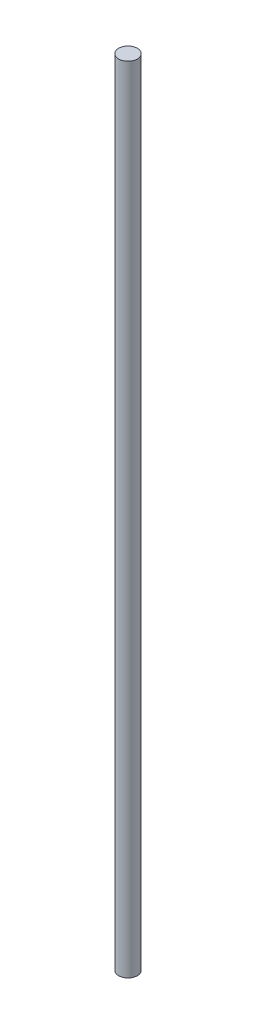
ISO-10303-21;
HEADER;
FILE_DESCRIPTION(('STEP AP214'),'2;1');
FILE_NAME('part.step','',(''),(''),'','','');
FILE_SCHEMA(('AUTOMOTIVE_DESIGN { 1 0 10303 214 1 1 1 1 }'));
ENDSEC;
DATA;
#1=APPLICATION_CONTEXT('core data for automotive mechanical design processes');
#2=APPLICATION_PROTOCOL_DEFINITION('international standard','automotive_design',2000,#1);
#3=PRODUCT_CONTEXT('',#1,'mechanical');
#4=PRODUCT('Part','Part','',(#3));
#5=PRODUCT_RELATED_PRODUCT_CATEGORY('part','',(#4));
#6=PRODUCT_DEFINITION_FORMATION('','',#4);
#7=PRODUCT_DEFINITION_CONTEXT('part definition',#1,'design');
#8=PRODUCT_DEFINITION('design','',#6,#7);
#9=PRODUCT_DEFINITION_SHAPE('','',#8);
#10=(LENGTH_UNIT() NAMED_UNIT(*) SI_UNIT(.MILLI.,.METRE.));
#11=(NAMED_UNIT(*) PLANE_ANGLE_UNIT() SI_UNIT($,.RADIAN.));
#12=(NAMED_UNIT(*) SI_UNIT($,.STERADIAN.) SOLID_ANGLE_UNIT());
#13=UNCERTAINTY_MEASURE_WITH_UNIT(LENGTH_MEASURE(1.E-05),#10,'distance_accuracy_value','');
#14=(GEOMETRIC_REPRESENTATION_CONTEXT(3) GLOBAL_UNCERTAINTY_ASSIGNED_CONTEXT((#13)) GLOBAL_UNIT_ASSIGNED_CONTEXT((#10,
#11,#12)) REPRESENTATION_CONTEXT('',''));
#15=CARTESIAN_POINT('',(0.,0.,0.));
#16=DIRECTION('',(0.,0.,1.));
#17=DIRECTION('',(1.,0.,0.));
#18=AXIS2_PLACEMENT_3D('',#15,#16,#17);
#19=CARTESIAN_POINT('',(0.,-170.,0.));
#20=DIRECTION('',(0.,1.,0.));
#21=DIRECTION('',(0.,0.,1.));
#22=AXIS2_PLACEMENT_3D('',#19,#20,#21);
#23=CYLINDRICAL_SURFACE('',#22,4.);
#24=CARTESIAN_POINT('',(0.,-170.,0.));
#25=DIRECTION('',(0.,1.,0.));
#26=DIRECTION('',(0.,0.,1.));
#27=AXIS2_PLACEMENT_3D('',#24,#25,#26);
#28=CIRCLE('',#27,4.);
#29=CARTESIAN_POINT('',(0.,-170.,4.));
#30=VERTEX_POINT('',#29);
#31=EDGE_CURVE('E10',#30,#30,#28,.T.);
#32=ORIENTED_EDGE('',*,*,#31,.T.);
#33=EDGE_LOOP('',(#32));
#34=FACE_BOUND('',#33,.T.);
#35=CARTESIAN_POINT('',(0.,170.,0.));
#36=DIRECTION('',(0.,1.,0.));
#37=DIRECTION('',(0.,0.,1.));
#38=AXIS2_PLACEMENT_3D('',#35,#36,#37);
#39=CIRCLE('',#38,4.);
#40=CARTESIAN_POINT('',(0.,170.,4.));
#41=VERTEX_POINT('',#40);
#42=EDGE_CURVE('E50',#41,#41,#39,.T.);
#43=ORIENTED_EDGE('',*,*,#42,.F.);
#44=EDGE_LOOP('',(#43));
#45=FACE_BOUND('',#44,.T.);
#46=ADVANCED_FACE('F43',(#34,#45),#23,.T.);
#47=CARTESIAN_POINT('',(0.,-170.,0.));
#48=DIRECTION('',(0.,1.,0.));
#49=DIRECTION('',(0.,0.,1.));
#50=AXIS2_PLACEMENT_3D('',#47,#48,#49);
#51=PLANE('',#50);
#52=ORIENTED_EDGE('',*,*,#31,.F.);
#53=EDGE_LOOP('',(#52));
#54=FACE_BOUND('',#53,.T.);
#55=ADVANCED_FACE('F60',(#54),#51,.F.);
#56=CARTESIAN_POINT('',(0.,170.,0.));
#57=DIRECTION('',(0.,1.,0.));
#58=DIRECTION('',(0.,0.,1.));
#59=AXIS2_PLACEMENT_3D('',#56,#57,#58);
#60=PLANE('',#59);
#61=ORIENTED_EDGE('',*,*,#42,.T.);
#62=EDGE_LOOP('',(#61));
#63=FACE_BOUND('',#62,.T.);
#64=ADVANCED_FACE('F57',(#63),#60,.T.);
#65=CLOSED_SHELL('',(#46,#55,#64));
#66=MANIFOLD_SOLID_BREP('B2',#65);
#67=ADVANCED_BREP_SHAPE_REPRESENTATION('',(#18,#66),#14);
#68=SHAPE_DEFINITION_REPRESENTATION(#9,#67);
ENDSEC;
END-ISO-10303-21;
